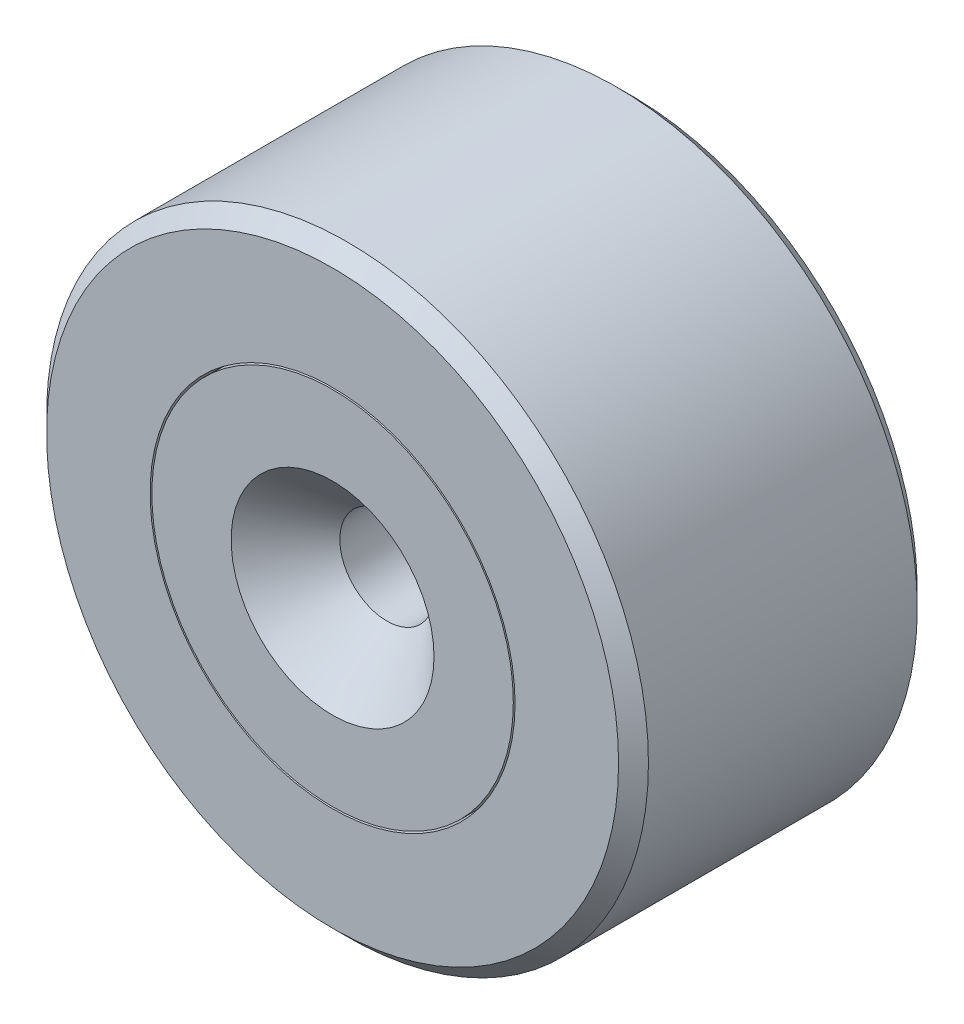
ISO-10303-21;
HEADER;
FILE_DESCRIPTION(('STEP AP214'),'2;1');
FILE_NAME('part.step','',(''),(''),'','','');
FILE_SCHEMA(('AUTOMOTIVE_DESIGN { 1 0 10303 214 1 1 1 1 }'));
ENDSEC;
DATA;
#1=APPLICATION_CONTEXT('core data for automotive mechanical design processes');
#2=APPLICATION_PROTOCOL_DEFINITION('international standard','automotive_design',2000,#1);
#3=PRODUCT_CONTEXT('',#1,'mechanical');
#4=PRODUCT('Part','Part','',(#3));
#5=PRODUCT_RELATED_PRODUCT_CATEGORY('part','',(#4));
#6=PRODUCT_DEFINITION_FORMATION('','',#4);
#7=PRODUCT_DEFINITION_CONTEXT('part definition',#1,'design');
#8=PRODUCT_DEFINITION('design','',#6,#7);
#9=PRODUCT_DEFINITION_SHAPE('','',#8);
#10=(LENGTH_UNIT() NAMED_UNIT(*) SI_UNIT(.MILLI.,.METRE.));
#11=(NAMED_UNIT(*) PLANE_ANGLE_UNIT() SI_UNIT($,.RADIAN.));
#12=(NAMED_UNIT(*) SI_UNIT($,.STERADIAN.) SOLID_ANGLE_UNIT());
#13=UNCERTAINTY_MEASURE_WITH_UNIT(LENGTH_MEASURE(1.E-05),#10,'distance_accuracy_value','');
#14=(GEOMETRIC_REPRESENTATION_CONTEXT(3) GLOBAL_UNCERTAINTY_ASSIGNED_CONTEXT((#13)) GLOBAL_UNIT_ASSIGNED_CONTEXT((#10,
#11,#12)) REPRESENTATION_CONTEXT('',''));
#15=CARTESIAN_POINT('',(0.,0.,0.));
#16=DIRECTION('',(0.,0.,1.));
#17=DIRECTION('',(1.,0.,0.));
#18=AXIS2_PLACEMENT_3D('',#15,#16,#17);
#19=CARTESIAN_POINT('',(0.,4.10613495879121,3.935));
#20=DIRECTION('',(0.,0.,-1.));
#21=DIRECTION('',(-1.,0.,0.));
#22=AXIS2_PLACEMENT_3D('',#19,#20,#21);
#23=PLANE('',#22);
#24=CARTESIAN_POINT('',(0.,0.,3.935));
#25=DIRECTION('',(0.,0.,1.));
#26=DIRECTION('',(1.,0.,0.));
#27=AXIS2_PLACEMENT_3D('',#24,#25,#26);
#28=CIRCLE('',#27,2.67354796410858);
#29=CARTESIAN_POINT('',(2.67354796410858,0.,3.935));
#30=VERTEX_POINT('',#29);
#31=EDGE_CURVE('E11',#30,#30,#28,.T.);
#32=ORIENTED_EDGE('',*,*,#31,.F.);
#33=EDGE_LOOP('',(#32));
#34=FACE_BOUND('',#33,.T.);
#35=CARTESIAN_POINT('',(0.,0.,3.935));
#36=DIRECTION('',(0.,0.,1.));
#37=DIRECTION('',(1.,0.,0.));
#38=AXIS2_PLACEMENT_3D('',#35,#36,#37);
#39=CIRCLE('',#38,4.7625);
#40=CARTESIAN_POINT('',(4.7625,0.,3.935));
#41=VERTEX_POINT('',#40);
#42=EDGE_CURVE('E62',#41,#41,#39,.T.);
#43=ORIENTED_EDGE('',*,*,#42,.T.);
#44=EDGE_LOOP('',(#43));
#45=FACE_BOUND('',#44,.T.);
#46=ADVANCED_FACE('F43',(#34,#45),#23,.F.);
#47=CARTESIAN_POINT('',(0.,0.,3.935));
#48=DIRECTION('',(0.,0.,1.));
#49=DIRECTION('',(1.,0.,0.));
#50=AXIS2_PLACEMENT_3D('',#47,#48,#49);
#51=CONICAL_SURFACE('',#50,2.67354796410858,0.785398163397448);
#52=CARTESIAN_POINT('',(0.,0.,2.50241300531736));
#53=DIRECTION('',(0.,0.,1.));
#54=DIRECTION('',(1.,0.,0.));
#55=AXIS2_PLACEMENT_3D('',#52,#53,#54);
#56=CIRCLE('',#55,1.24096096942594);
#57=CARTESIAN_POINT('',(1.24096096942594,0.,2.50241300531736));
#58=VERTEX_POINT('',#57);
#59=EDGE_CURVE('E49',#58,#58,#56,.T.);
#60=ORIENTED_EDGE('',*,*,#59,.F.);
#61=EDGE_LOOP('',(#60));
#62=FACE_BOUND('',#61,.T.);
#63=ORIENTED_EDGE('',*,*,#31,.T.);
#64=EDGE_LOOP('',(#63));
#65=FACE_BOUND('',#64,.T.);
#66=ADVANCED_FACE('F92',(#62,#65),#51,.F.);
#67=CARTESIAN_POINT('',(0.,0.,3.935));
#68=DIRECTION('',(0.,0.,1.));
#69=DIRECTION('',(1.,0.,0.));
#70=AXIS2_PLACEMENT_3D('',#67,#68,#69);
#71=CYLINDRICAL_SURFACE('',#70,1.24096096942594);
#72=ORIENTED_EDGE('',*,*,#59,.T.);
#73=EDGE_LOOP('',(#72));
#74=FACE_BOUND('',#73,.T.);
#75=CARTESIAN_POINT('',(0.,0.,-0.201578427549238));
#76=DIRECTION('',(0.,0.,1.));
#77=DIRECTION('',(1.,0.,0.));
#78=AXIS2_PLACEMENT_3D('',#75,#76,#77);
#79=CIRCLE('',#78,1.24096096942594);
#80=CARTESIAN_POINT('',(1.24096096942594,0.,-0.201578427549238));
#81=VERTEX_POINT('',#80);
#82=EDGE_CURVE('E53',#81,#81,#79,.T.);
#83=ORIENTED_EDGE('',*,*,#82,.F.);
#84=EDGE_LOOP('',(#83));
#85=FACE_BOUND('',#84,.T.);
#86=ADVANCED_FACE('F87',(#74,#85),#71,.F.);
#87=CARTESIAN_POINT('',(0.,0.,-0.201578427549238));
#88=DIRECTION('',(0.,0.,1.));
#89=DIRECTION('',(1.,0.,0.));
#90=AXIS2_PLACEMENT_3D('',#87,#88,#89);
#91=CONICAL_SURFACE('',#90,1.24096096942594,1.40861555321757);
#92=CARTESIAN_POINT('',(0.,0.,0.));
#93=DIRECTION('',(0.,0.,1.));
#94=DIRECTION('',(1.,0.,0.));
#95=AXIS2_PLACEMENT_3D('',#92,#93,#94);
#96=CIRCLE('',#95,2.47296875);
#97=CARTESIAN_POINT('',(2.47296875,0.,0.));
#98=VERTEX_POINT('',#97);
#99=EDGE_CURVE('E57',#98,#98,#96,.T.);
#100=ORIENTED_EDGE('',*,*,#99,.F.);
#101=EDGE_LOOP('',(#100));
#102=FACE_BOUND('',#101,.T.);
#103=ORIENTED_EDGE('',*,*,#82,.T.);
#104=EDGE_LOOP('',(#103));
#105=FACE_BOUND('',#104,.T.);
#106=ADVANCED_FACE('F83',(#102,#105),#91,.T.);
#107=CARTESIAN_POINT('',(0.,0.,3.935));
#108=DIRECTION('',(0.,0.,1.));
#109=DIRECTION('',(1.,0.,0.));
#110=AXIS2_PLACEMENT_3D('',#107,#108,#109);
#111=CYLINDRICAL_SURFACE('',#110,4.7625);
#112=ORIENTED_EDGE('',*,*,#42,.F.);
#113=EDGE_LOOP('',(#112));
#114=FACE_BOUND('',#113,.T.);
#115=CARTESIAN_POINT('',(0.,0.,-2.67236385511183));
#116=DIRECTION('',(0.,0.,1.));
#117=DIRECTION('',(1.,0.,0.));
#118=AXIS2_PLACEMENT_3D('',#115,#116,#117);
#119=CIRCLE('',#118,4.7625);
#120=CARTESIAN_POINT('',(4.7625,0.,-2.67236385511183));
#121=VERTEX_POINT('',#120);
#122=EDGE_CURVE('E65',#121,#121,#119,.T.);
#123=ORIENTED_EDGE('',*,*,#122,.T.);
#124=EDGE_LOOP('',(#123));
#125=FACE_BOUND('',#124,.T.);
#126=ADVANCED_FACE('F86',(#114,#125),#111,.T.);
#127=CARTESIAN_POINT('',(0.,4.10613495879121,-2.67236385511183));
#128=DIRECTION('',(0.,0.,1.));
#129=DIRECTION('',(1.,0.,0.));
#130=AXIS2_PLACEMENT_3D('',#127,#128,#129);
#131=PLANE('',#130);
#132=ORIENTED_EDGE('',*,*,#122,.F.);
#133=EDGE_LOOP('',(#132));
#134=FACE_BOUND('',#133,.T.);
#135=CARTESIAN_POINT('',(0.,0.,-2.67236385511183));
#136=DIRECTION('',(0.,0.,1.));
#137=DIRECTION('',(1.,0.,0.));
#138=AXIS2_PLACEMENT_3D('',#135,#136,#137);
#139=CIRCLE('',#138,4.10613495879121);
#140=CARTESIAN_POINT('',(4.10613495879121,0.,-2.67236385511183));
#141=VERTEX_POINT('',#140);
#142=EDGE_CURVE('E68',#141,#141,#139,.T.);
#143=ORIENTED_EDGE('',*,*,#142,.T.);
#144=EDGE_LOOP('',(#143));
#145=FACE_BOUND('',#144,.T.);
#146=ADVANCED_FACE('F107',(#134,#145),#131,.F.);
#147=CARTESIAN_POINT('',(0.,0.,3.935));
#148=DIRECTION('',(0.,0.,1.));
#149=DIRECTION('',(1.,0.,0.));
#150=AXIS2_PLACEMENT_3D('',#147,#148,#149);
#151=CYLINDRICAL_SURFACE('',#150,4.10613495879121);
#152=ORIENTED_EDGE('',*,*,#142,.F.);
#153=EDGE_LOOP('',(#152));
#154=FACE_BOUND('',#153,.T.);
#155=CARTESIAN_POINT('',(0.,0.,-1.95304800903681));
#156=DIRECTION('',(0.,0.,1.));
#157=DIRECTION('',(1.,0.,0.));
#158=AXIS2_PLACEMENT_3D('',#155,#156,#157);
#159=CIRCLE('',#158,4.10613495879121);
#160=CARTESIAN_POINT('',(4.10613495879121,0.,-1.95304800903681));
#161=VERTEX_POINT('',#160);
#162=EDGE_CURVE('E71',#161,#161,#159,.T.);
#163=ORIENTED_EDGE('',*,*,#162,.T.);
#164=EDGE_LOOP('',(#163));
#165=FACE_BOUND('',#164,.T.);
#166=ADVANCED_FACE('F75',(#154,#165),#151,.F.);
#167=CARTESIAN_POINT('',(0.,0.,0.));
#168=DIRECTION('',(0.,0.,1.));
#169=DIRECTION('',(1.,0.,0.));
#170=AXIS2_PLACEMENT_3D('',#167,#168,#169);
#171=TOROIDAL_SURFACE('',#170,4.45734375,1.984375);
#172=ORIENTED_EDGE('',*,*,#162,.F.);
#173=EDGE_LOOP('',(#172));
#174=FACE_BOUND('',#173,.T.);
#175=ORIENTED_EDGE('',*,*,#99,.T.);
#176=EDGE_LOOP('',(#175));
#177=FACE_BOUND('',#176,.T.);
#178=ADVANCED_FACE('F77',(#174,#177),#171,.T.);
#179=CLOSED_SHELL('',(#46,#66,#86,#106,#126,#146,#166,#178));
#180=MANIFOLD_SOLID_BREP('B2',#179);
#181=CARTESIAN_POINT('',(0.,0.,3.5415));
#182=DIRECTION('',(0.,0.,-1.));
#183=DIRECTION('',(-1.,0.,0.));
#184=AXIS2_PLACEMENT_3D('',#181,#182,#183);
#185=CONICAL_SURFACE('',#184,7.93,0.785398163397446);
#186=CARTESIAN_POINT('',(0.,0.,3.935));
#187=DIRECTION('',(0.,0.,1.));
#188=DIRECTION('',(1.,0.,0.));
#189=AXIS2_PLACEMENT_3D('',#186,#187,#188);
#190=CIRCLE('',#189,7.5365);
#191=CARTESIAN_POINT('',(7.5365,0.,3.935));
#192=VERTEX_POINT('',#191);
#193=EDGE_CURVE('E196',#192,#192,#190,.T.);
#194=ORIENTED_EDGE('',*,*,#193,.F.);
#195=EDGE_LOOP('',(#194));
#196=FACE_BOUND('',#195,.T.);
#197=CARTESIAN_POINT('',(0.,0.,3.5415));
#198=DIRECTION('',(0.,0.,1.));
#199=DIRECTION('',(1.,0.,0.));
#200=AXIS2_PLACEMENT_3D('',#197,#198,#199);
#201=CIRCLE('',#200,7.93);
#202=CARTESIAN_POINT('',(7.93,0.,3.5415));
#203=VERTEX_POINT('',#202);
#204=EDGE_CURVE('E42',#203,#203,#201,.T.);
#205=ORIENTED_EDGE('',*,*,#204,.T.);
#206=EDGE_LOOP('',(#205));
#207=FACE_BOUND('',#206,.T.);
#208=ADVANCED_FACE('F168',(#196,#207),#185,.T.);
#209=CARTESIAN_POINT('',(0.,0.,3.935));
#210=DIRECTION('',(0.,0.,1.));
#211=DIRECTION('',(1.,0.,0.));
#212=AXIS2_PLACEMENT_3D('',#209,#210,#211);
#213=CYLINDRICAL_SURFACE('',#212,7.93);
#214=ORIENTED_EDGE('',*,*,#204,.F.);
#215=EDGE_LOOP('',(#214));
#216=FACE_BOUND('',#215,.T.);
#217=CARTESIAN_POINT('',(0.,0.,-3.5415));
#218=DIRECTION('',(0.,0.,1.));
#219=DIRECTION('',(1.,0.,0.));
#220=AXIS2_PLACEMENT_3D('',#217,#218,#219);
#221=CIRCLE('',#220,7.93);
#222=CARTESIAN_POINT('',(7.93,0.,-3.5415));
#223=VERTEX_POINT('',#222);
#224=EDGE_CURVE('E174',#223,#223,#221,.T.);
#225=ORIENTED_EDGE('',*,*,#224,.T.);
#226=EDGE_LOOP('',(#225));
#227=FACE_BOUND('',#226,.T.);
#228=ADVANCED_FACE('F203',(#216,#227),#213,.T.);
#229=CARTESIAN_POINT('',(0.,0.,-3.935));
#230=DIRECTION('',(0.,0.,1.));
#231=DIRECTION('',(1.,0.,0.));
#232=AXIS2_PLACEMENT_3D('',#229,#230,#231);
#233=CONICAL_SURFACE('',#232,7.5365,0.785398163397445);
#234=ORIENTED_EDGE('',*,*,#224,.F.);
#235=EDGE_LOOP('',(#234));
#236=FACE_BOUND('',#235,.T.);
#237=CARTESIAN_POINT('',(0.,0.,-3.935));
#238=DIRECTION('',(0.,0.,1.));
#239=DIRECTION('',(1.,0.,0.));
#240=AXIS2_PLACEMENT_3D('',#237,#238,#239);
#241=CIRCLE('',#240,7.5365);
#242=CARTESIAN_POINT('',(7.5365,0.,-3.935));
#243=VERTEX_POINT('',#242);
#244=EDGE_CURVE('E178',#243,#243,#241,.T.);
#245=ORIENTED_EDGE('',*,*,#244,.T.);
#246=EDGE_LOOP('',(#245));
#247=FACE_BOUND('',#246,.T.);
#248=ADVANCED_FACE('F207',(#236,#247),#233,.T.);
#249=CARTESIAN_POINT('',(0.,7.5365,-3.935));
#250=DIRECTION('',(0.,0.,1.));
#251=DIRECTION('',(1.,0.,0.));
#252=AXIS2_PLACEMENT_3D('',#249,#250,#251);
#253=PLANE('',#252);
#254=ORIENTED_EDGE('',*,*,#244,.F.);
#255=EDGE_LOOP('',(#254));
#256=FACE_BOUND('',#255,.T.);
#257=CARTESIAN_POINT('',(0.,0.,-3.935));
#258=DIRECTION('',(0.,0.,1.));
#259=DIRECTION('',(1.,0.,0.));
#260=AXIS2_PLACEMENT_3D('',#257,#258,#259);
#261=CIRCLE('',#260,4.80855254120879);
#262=CARTESIAN_POINT('',(4.80855254120879,0.,-3.935));
#263=VERTEX_POINT('',#262);
#264=EDGE_CURVE('E182',#263,#263,#261,.T.);
#265=ORIENTED_EDGE('',*,*,#264,.T.);
#266=EDGE_LOOP('',(#265));
#267=FACE_BOUND('',#266,.T.);
#268=ADVANCED_FACE('F212',(#256,#267),#253,.F.);
#269=CARTESIAN_POINT('',(0.,0.,3.935));
#270=DIRECTION('',(0.,0.,1.));
#271=DIRECTION('',(1.,0.,0.));
#272=AXIS2_PLACEMENT_3D('',#269,#270,#271);
#273=CYLINDRICAL_SURFACE('',#272,4.80855254120879);
#274=ORIENTED_EDGE('',*,*,#264,.F.);
#275=EDGE_LOOP('',(#274));
#276=FACE_BOUND('',#275,.T.);
#277=CARTESIAN_POINT('',(0.,0.,-1.95304800903681));
#278=DIRECTION('',(0.,0.,1.));
#279=DIRECTION('',(1.,0.,0.));
#280=AXIS2_PLACEMENT_3D('',#277,#278,#279);
#281=CIRCLE('',#280,4.80855254120879);
#282=CARTESIAN_POINT('',(4.80855254120879,0.,-1.95304800903681));
#283=VERTEX_POINT('',#282);
#284=EDGE_CURVE('E187',#283,#283,#281,.T.);
#285=ORIENTED_EDGE('',*,*,#284,.T.);
#286=EDGE_LOOP('',(#285));
#287=FACE_BOUND('',#286,.T.);
#288=ADVANCED_FACE('F218',(#276,#287),#273,.F.);
#289=CARTESIAN_POINT('',(0.,0.,0.));
#290=DIRECTION('',(0.,0.,1.));
#291=DIRECTION('',(1.,0.,0.));
#292=AXIS2_PLACEMENT_3D('',#289,#290,#291);
#293=TOROIDAL_SURFACE('',#292,4.45734375,1.984375);
#294=ORIENTED_EDGE('',*,*,#284,.F.);
#295=EDGE_LOOP('',(#294));
#296=FACE_BOUND('',#295,.T.);
#297=CARTESIAN_POINT('',(0.,0.,1.95304800903681));
#298=DIRECTION('',(0.,0.,1.));
#299=DIRECTION('',(1.,0.,0.));
#300=AXIS2_PLACEMENT_3D('',#297,#298,#299);
#301=CIRCLE('',#300,4.80855254120879);
#302=CARTESIAN_POINT('',(4.80855254120879,0.,1.95304800903681));
#303=VERTEX_POINT('',#302);
#304=EDGE_CURVE('E190',#303,#303,#301,.T.);
#305=ORIENTED_EDGE('',*,*,#304,.T.);
#306=EDGE_LOOP('',(#305));
#307=FACE_BOUND('',#306,.T.);
#308=ADVANCED_FACE('F222',(#296,#307),#293,.F.);
#309=CARTESIAN_POINT('',(0.,0.,3.935));
#310=DIRECTION('',(0.,0.,1.));
#311=DIRECTION('',(1.,0.,0.));
#312=AXIS2_PLACEMENT_3D('',#309,#310,#311);
#313=CYLINDRICAL_SURFACE('',#312,4.80855254120879);
#314=ORIENTED_EDGE('',*,*,#304,.F.);
#315=EDGE_LOOP('',(#314));
#316=FACE_BOUND('',#315,.T.);
#317=CARTESIAN_POINT('',(0.,0.,3.935));
#318=DIRECTION('',(0.,0.,1.));
#319=DIRECTION('',(1.,0.,0.));
#320=AXIS2_PLACEMENT_3D('',#317,#318,#319);
#321=CIRCLE('',#320,4.80855254120879);
#322=CARTESIAN_POINT('',(4.80855254120879,0.,3.935));
#323=VERTEX_POINT('',#322);
#324=EDGE_CURVE('E193',#323,#323,#321,.T.);
#325=ORIENTED_EDGE('',*,*,#324,.T.);
#326=EDGE_LOOP('',(#325));
#327=FACE_BOUND('',#326,.T.);
#328=ADVANCED_FACE('F226',(#316,#327),#313,.F.);
#329=CARTESIAN_POINT('',(0.,7.5365,3.935));
#330=DIRECTION('',(0.,0.,-1.));
#331=DIRECTION('',(-1.,0.,0.));
#332=AXIS2_PLACEMENT_3D('',#329,#330,#331);
#333=PLANE('',#332);
#334=ORIENTED_EDGE('',*,*,#324,.F.);
#335=EDGE_LOOP('',(#334));
#336=FACE_BOUND('',#335,.T.);
#337=ORIENTED_EDGE('',*,*,#193,.T.);
#338=EDGE_LOOP('',(#337));
#339=FACE_BOUND('',#338,.T.);
#340=ADVANCED_FACE('F200',(#336,#339),#333,.F.);
#341=CLOSED_SHELL('',(#208,#228,#248,#268,#288,#308,#328,#340));
#342=MANIFOLD_SOLID_BREP('B6',#341);
#343=ADVANCED_BREP_SHAPE_REPRESENTATION('',(#18,#180,#342),#14);
#344=SHAPE_DEFINITION_REPRESENTATION(#9,#343);
ENDSEC;
END-ISO-10303-21;
